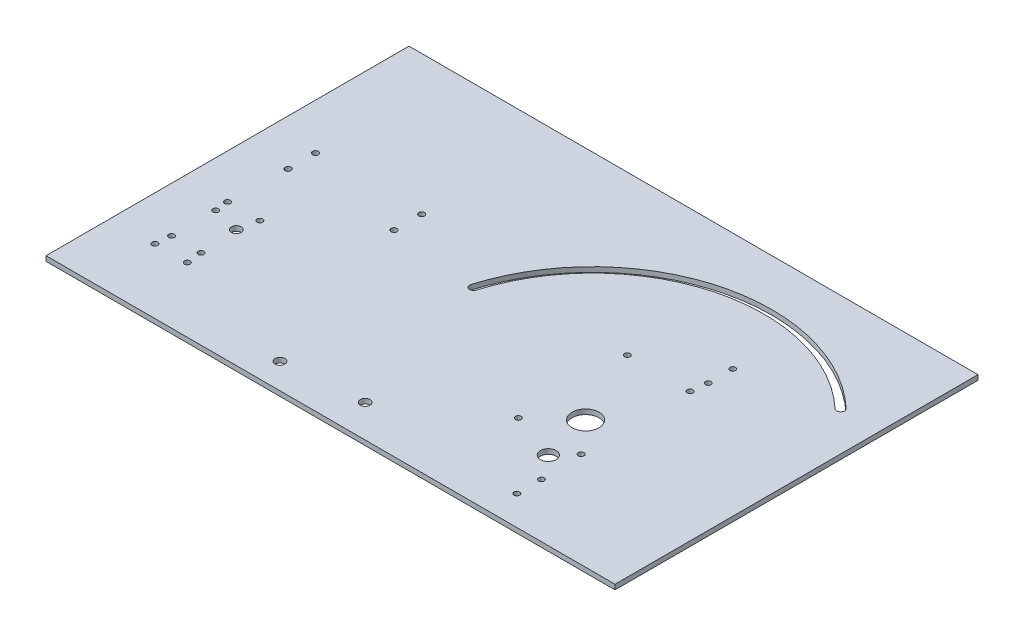
ISO-10303-21;
HEADER;
FILE_DESCRIPTION(('STEP AP214'),'2;1');
FILE_NAME('part.step','',(''),(''),'','','');
FILE_SCHEMA(('AUTOMOTIVE_DESIGN { 1 0 10303 214 1 1 1 1 }'));
ENDSEC;
DATA;
#1=APPLICATION_CONTEXT('core data for automotive mechanical design processes');
#2=APPLICATION_PROTOCOL_DEFINITION('international standard','automotive_design',2000,#1);
#3=PRODUCT_CONTEXT('',#1,'mechanical');
#4=PRODUCT('Part','Part','',(#3));
#5=PRODUCT_RELATED_PRODUCT_CATEGORY('part','',(#4));
#6=PRODUCT_DEFINITION_FORMATION('','',#4);
#7=PRODUCT_DEFINITION_CONTEXT('part definition',#1,'design');
#8=PRODUCT_DEFINITION('design','',#6,#7);
#9=PRODUCT_DEFINITION_SHAPE('','',#8);
#10=(LENGTH_UNIT() NAMED_UNIT(*) SI_UNIT(.MILLI.,.METRE.));
#11=(NAMED_UNIT(*) PLANE_ANGLE_UNIT() SI_UNIT($,.RADIAN.));
#12=(NAMED_UNIT(*) SI_UNIT($,.STERADIAN.) SOLID_ANGLE_UNIT());
#13=UNCERTAINTY_MEASURE_WITH_UNIT(LENGTH_MEASURE(1.E-05),#10,'distance_accuracy_value','');
#14=(GEOMETRIC_REPRESENTATION_CONTEXT(3) GLOBAL_UNCERTAINTY_ASSIGNED_CONTEXT((#13)) GLOBAL_UNIT_ASSIGNED_CONTEXT((#10,
#11,#12)) REPRESENTATION_CONTEXT('',''));
#15=CARTESIAN_POINT('',(0.,0.,0.));
#16=DIRECTION('',(0.,0.,1.));
#17=DIRECTION('',(1.,0.,0.));
#18=AXIS2_PLACEMENT_3D('',#15,#16,#17);
#19=CARTESIAN_POINT('',(0.,3.175,0.));
#20=DIRECTION('',(0.,1.,0.));
#21=DIRECTION('',(0.,0.,1.));
#22=AXIS2_PLACEMENT_3D('',#19,#20,#21);
#23=PLANE('',#22);
#24=CARTESIAN_POINT('',(106.410453434672,3.175,0.373429287609625));
#25=DIRECTION('',(0.,-1.,0.));
#26=DIRECTION('',(0.,0.,1.));
#27=AXIS2_PLACEMENT_3D('',#24,#25,#26);
#28=CIRCLE('',#27,116.205);
#29=CARTESIAN_POINT('',(-5.05726801654176,3.175,-32.4678419952538));
#30=VERTEX_POINT('',#29);
#31=CARTESIAN_POINT('',(185.887196571292,3.175,-84.4030375259801));
#32=VERTEX_POINT('',#31);
#33=EDGE_CURVE('E110',#30,#32,#28,.T.);
#34=ORIENTED_EDGE('',*,*,#33,.T.);
#35=CARTESIAN_POINT('',(184.15,3.175,-82.55));
#36=DIRECTION('',(0.,-1.,0.));
#37=DIRECTION('',(0.,0.,-1.));
#38=AXIS2_PLACEMENT_3D('',#35,#36,#37);
#39=CIRCLE('',#38,2.54);
#40=CARTESIAN_POINT('',(182.412803428708,3.175,-80.6969624740199));
#41=VERTEX_POINT('',#40);
#42=EDGE_CURVE('E120',#32,#41,#39,.T.);
#43=ORIENTED_EDGE('',*,*,#42,.T.);
#44=CARTESIAN_POINT('',(106.410453434672,3.175,0.373429287609625));
#45=DIRECTION('',(0.,1.,0.));
#46=DIRECTION('',(0.,0.,1.));
#47=AXIS2_PLACEMENT_3D('',#44,#45,#46);
#48=CIRCLE('',#47,111.125);
#49=CARTESIAN_POINT('',(-0.184362160750962,3.175,-31.0321580047462));
#50=VERTEX_POINT('',#49);
#51=EDGE_CURVE('E58',#41,#50,#48,.T.);
#52=ORIENTED_EDGE('',*,*,#51,.T.);
#53=CARTESIAN_POINT('',(-2.62081508864638,3.175,-31.75));
#54=DIRECTION('',(0.,-1.,0.));
#55=DIRECTION('',(0.,0.,-1.));
#56=AXIS2_PLACEMENT_3D('',#53,#54,#55);
#57=CIRCLE('',#56,2.54000000000001);
#58=EDGE_CURVE('E117',#50,#30,#57,.T.);
#59=ORIENTED_EDGE('',*,*,#58,.T.);
#60=EDGE_LOOP('',(#34,#43,#52,#59));
#61=FACE_BOUND('',#60,.T.);
#62=DIRECTION('',(1.,0.,0.));
#63=VECTOR('',#62,1.);
#64=CARTESIAN_POINT('',(-158.75,3.175,-146.05));
#65=LINE('',#64,#63);
#66=CARTESIAN_POINT('',(-158.75,3.175,-146.05));
#67=VERTEX_POINT('',#66);
#68=CARTESIAN_POINT('',(209.55,3.175,-146.05));
#69=VERTEX_POINT('',#68);
#70=EDGE_CURVE('E156',#67,#69,#65,.T.);
#71=ORIENTED_EDGE('',*,*,#70,.F.);
#72=DIRECTION('',(0.,0.,1.));
#73=VECTOR('',#72,1.);
#74=CARTESIAN_POINT('',(-158.75,3.175,-88.9));
#75=LINE('',#74,#73);
#76=CARTESIAN_POINT('',(-158.75,3.175,88.9));
#77=VERTEX_POINT('',#76);
#78=EDGE_CURVE('E375',#67,#77,#75,.T.);
#79=ORIENTED_EDGE('',*,*,#78,.T.);
#80=DIRECTION('',(1.,0.,0.));
#81=VECTOR('',#80,1.);
#82=CARTESIAN_POINT('',(-158.75,3.175,88.9));
#83=LINE('',#82,#81);
#84=CARTESIAN_POINT('',(209.55,3.175,88.9));
#85=VERTEX_POINT('',#84);
#86=EDGE_CURVE('E51',#77,#85,#83,.T.);
#87=ORIENTED_EDGE('',*,*,#86,.T.);
#88=DIRECTION('',(0.,0.,1.));
#89=VECTOR('',#88,1.);
#90=CARTESIAN_POINT('',(209.55,3.175,-146.05));
#91=LINE('',#90,#89);
#92=EDGE_CURVE('E160',#69,#85,#91,.T.);
#93=ORIENTED_EDGE('',*,*,#92,.F.);
#94=EDGE_LOOP('',(#71,#79,#87,#93));
#95=FACE_BOUND('',#94,.T.);
#96=CARTESIAN_POINT('',(-129.2225,3.175,37.1475));
#97=DIRECTION('',(0.,1.,0.));
#98=DIRECTION('',(0.,0.,1.));
#99=AXIS2_PLACEMENT_3D('',#96,#97,#98);
#100=CIRCLE('',#99,1.84149999999993);
#101=CARTESIAN_POINT('',(-129.2225,3.175,38.989));
#102=VERTEX_POINT('',#101);
#103=EDGE_CURVE('E215',#102,#102,#100,.T.);
#104=ORIENTED_EDGE('',*,*,#103,.F.);
#105=EDGE_LOOP('',(#104));
#106=FACE_BOUND('',#105,.T.);
#107=CARTESIAN_POINT('',(-130.175,3.175,46.99));
#108=DIRECTION('',(0.,1.,0.));
#109=DIRECTION('',(0.,0.,1.));
#110=AXIS2_PLACEMENT_3D('',#107,#108,#109);
#111=CIRCLE('',#110,1.84149999999999);
#112=CARTESIAN_POINT('',(-130.175,3.175,48.8315));
#113=VERTEX_POINT('',#112);
#114=EDGE_CURVE('E224',#113,#113,#111,.T.);
#115=ORIENTED_EDGE('',*,*,#114,.F.);
#116=EDGE_LOOP('',(#115));
#117=FACE_BOUND('',#116,.T.);
#118=CARTESIAN_POINT('',(-110.1725,3.175,37.1475));
#119=DIRECTION('',(0.,1.,0.));
#120=DIRECTION('',(0.,0.,1.));
#121=AXIS2_PLACEMENT_3D('',#118,#119,#120);
#122=CIRCLE('',#121,1.84149999999996);
#123=CARTESIAN_POINT('',(-110.1725,3.175,38.989));
#124=VERTEX_POINT('',#123);
#125=EDGE_CURVE('E199',#124,#124,#122,.T.);
#126=ORIENTED_EDGE('',*,*,#125,.F.);
#127=EDGE_LOOP('',(#126));
#128=FACE_BOUND('',#127,.T.);
#129=CARTESIAN_POINT('',(-129.2225,3.175,8.57250000000002));
#130=DIRECTION('',(0.,1.,0.));
#131=DIRECTION('',(0.,0.,1.));
#132=AXIS2_PLACEMENT_3D('',#129,#130,#131);
#133=CIRCLE('',#132,1.84150000000002);
#134=CARTESIAN_POINT('',(-129.2225,3.175,10.414));
#135=VERTEX_POINT('',#134);
#136=EDGE_CURVE('E208',#135,#135,#133,.T.);
#137=ORIENTED_EDGE('',*,*,#136,.F.);
#138=EDGE_LOOP('',(#137));
#139=FACE_BOUND('',#138,.T.);
#140=CARTESIAN_POINT('',(85.0900000000001,3.175,-43.4975));
#141=DIRECTION('',(0.,1.,0.));
#142=DIRECTION('',(0.,0.,1.));
#143=AXIS2_PLACEMENT_3D('',#140,#141,#142);
#144=CIRCLE('',#143,1.84150000000004);
#145=CARTESIAN_POINT('',(85.0900000000001,3.175,-41.6559999999999));
#146=VERTEX_POINT('',#145);
#147=EDGE_CURVE('E247',#146,#146,#144,.T.);
#148=ORIENTED_EDGE('',*,*,#147,.F.);
#149=EDGE_LOOP('',(#148));
#150=FACE_BOUND('',#149,.T.);
#151=CARTESIAN_POINT('',(85.0900000000001,3.175,26.9875));
#152=DIRECTION('',(0.,1.,0.));
#153=DIRECTION('',(0.,0.,1.));
#154=AXIS2_PLACEMENT_3D('',#151,#152,#153);
#155=CIRCLE('',#154,1.84149999999996);
#156=CARTESIAN_POINT('',(85.0900000000001,3.175,28.829));
#157=VERTEX_POINT('',#156);
#158=EDGE_CURVE('E256',#157,#157,#155,.T.);
#159=ORIENTED_EDGE('',*,*,#158,.F.);
#160=EDGE_LOOP('',(#159));
#161=FACE_BOUND('',#160,.T.);
#162=CARTESIAN_POINT('',(125.73,3.175,26.9875));
#163=DIRECTION('',(0.,1.,0.));
#164=DIRECTION('',(0.,0.,1.));
#165=AXIS2_PLACEMENT_3D('',#162,#163,#164);
#166=CIRCLE('',#165,1.84149999999999);
#167=CARTESIAN_POINT('',(125.73,3.175,28.829));
#168=VERTEX_POINT('',#167);
#169=EDGE_CURVE('E231',#168,#168,#166,.T.);
#170=ORIENTED_EDGE('',*,*,#169,.F.);
#171=EDGE_LOOP('',(#170));
#172=FACE_BOUND('',#171,.T.);
#173=CARTESIAN_POINT('',(-109.22,3.175,46.99));
#174=DIRECTION('',(0.,1.,0.));
#175=DIRECTION('',(0.,0.,1.));
#176=AXIS2_PLACEMENT_3D('',#173,#174,#175);
#177=CIRCLE('',#176,1.8415);
#178=CARTESIAN_POINT('',(-109.22,3.175,48.8315));
#179=VERTEX_POINT('',#178);
#180=EDGE_CURVE('E240',#179,#179,#177,.T.);
#181=ORIENTED_EDGE('',*,*,#180,.F.);
#182=EDGE_LOOP('',(#181));
#183=FACE_BOUND('',#182,.T.);
#184=CARTESIAN_POINT('',(-130.175,3.175,0.));
#185=DIRECTION('',(0.,1.,0.));
#186=DIRECTION('',(0.,0.,1.));
#187=AXIS2_PLACEMENT_3D('',#184,#185,#186);
#188=CIRCLE('',#187,1.84149999999999);
#189=CARTESIAN_POINT('',(-130.175,3.175,1.8415));
#190=VERTEX_POINT('',#189);
#191=EDGE_CURVE('E183',#190,#190,#188,.T.);
#192=ORIENTED_EDGE('',*,*,#191,.F.);
#193=EDGE_LOOP('',(#192));
#194=FACE_BOUND('',#193,.T.);
#195=CARTESIAN_POINT('',(-109.22,3.175,0.));
#196=DIRECTION('',(0.,1.,0.));
#197=DIRECTION('',(0.,0.,1.));
#198=AXIS2_PLACEMENT_3D('',#195,#196,#197);
#199=CIRCLE('',#198,1.8415);
#200=CARTESIAN_POINT('',(-109.22,3.175,1.84150000000001));
#201=VERTEX_POINT('',#200);
#202=EDGE_CURVE('E192',#201,#201,#199,.T.);
#203=ORIENTED_EDGE('',*,*,#202,.F.);
#204=EDGE_LOOP('',(#203));
#205=FACE_BOUND('',#204,.T.);
#206=CARTESIAN_POINT('',(125.73,3.175,-43.4975));
#207=DIRECTION('',(0.,1.,0.));
#208=DIRECTION('',(0.,0.,1.));
#209=AXIS2_PLACEMENT_3D('',#206,#207,#208);
#210=CIRCLE('',#209,1.84150000000002);
#211=CARTESIAN_POINT('',(125.73,3.175,-41.6559999999999));
#212=VERTEX_POINT('',#211);
#213=EDGE_CURVE('E251',#212,#212,#210,.T.);
#214=ORIENTED_EDGE('',*,*,#213,.F.);
#215=EDGE_LOOP('',(#214));
#216=FACE_BOUND('',#215,.T.);
#217=CARTESIAN_POINT('',(127.,3.175,69.85));
#218=DIRECTION('',(0.,-1.,0.));
#219=DIRECTION('',(0.,0.,-1.));
#220=AXIS2_PLACEMENT_3D('',#217,#218,#219);
#221=CIRCLE('',#220,1.80340000000001);
#222=CARTESIAN_POINT('',(127.,3.175,68.0466));
#223=VERTEX_POINT('',#222);
#224=EDGE_CURVE('E271',#223,#223,#221,.T.);
#225=ORIENTED_EDGE('',*,*,#224,.T.);
#226=EDGE_LOOP('',(#225));
#227=FACE_BOUND('',#226,.T.);
#228=CARTESIAN_POINT('',(127.,3.175,53.975));
#229=DIRECTION('',(0.,-1.,0.));
#230=DIRECTION('',(0.,0.,-1.));
#231=AXIS2_PLACEMENT_3D('',#228,#229,#230);
#232=CIRCLE('',#231,1.80340000000001);
#233=CARTESIAN_POINT('',(127.,3.175,52.1716));
#234=VERTEX_POINT('',#233);
#235=EDGE_CURVE('E284',#234,#234,#232,.T.);
#236=ORIENTED_EDGE('',*,*,#235,.T.);
#237=EDGE_LOOP('',(#236));
#238=FACE_BOUND('',#237,.T.);
#239=CARTESIAN_POINT('',(127.,3.175,-53.975));
#240=DIRECTION('',(0.,-1.,0.));
#241=DIRECTION('',(0.,0.,-1.));
#242=AXIS2_PLACEMENT_3D('',#239,#240,#241);
#243=CIRCLE('',#242,1.80340000000001);
#244=CARTESIAN_POINT('',(127.,3.175,-55.7784));
#245=VERTEX_POINT('',#244);
#246=EDGE_CURVE('E292',#245,#245,#243,.T.);
#247=ORIENTED_EDGE('',*,*,#246,.T.);
#248=EDGE_LOOP('',(#247));
#249=FACE_BOUND('',#248,.T.);
#250=CARTESIAN_POINT('',(127.,3.175,-69.85));
#251=DIRECTION('',(0.,-1.,0.));
#252=DIRECTION('',(0.,0.,-1.));
#253=AXIS2_PLACEMENT_3D('',#250,#251,#252);
#254=CIRCLE('',#253,1.80340000000001);
#255=CARTESIAN_POINT('',(127.,3.175,-71.6534));
#256=VERTEX_POINT('',#255);
#257=EDGE_CURVE('E267',#256,#256,#254,.T.);
#258=ORIENTED_EDGE('',*,*,#257,.T.);
#259=EDGE_LOOP('',(#258));
#260=FACE_BOUND('',#259,.T.);
#261=CARTESIAN_POINT('',(115.57,3.175,38.1));
#262=DIRECTION('',(0.,1.,0.));
#263=DIRECTION('',(0.,0.,1.));
#264=AXIS2_PLACEMENT_3D('',#261,#262,#263);
#265=CIRCLE('',#264,5.08000000000001);
#266=CARTESIAN_POINT('',(115.57,3.175,43.18));
#267=VERTEX_POINT('',#266);
#268=EDGE_CURVE('E275',#267,#267,#265,.T.);
#269=ORIENTED_EDGE('',*,*,#268,.F.);
#270=EDGE_LOOP('',(#269));
#271=FACE_BOUND('',#270,.T.);
#272=CARTESIAN_POINT('',(-23.829539608584,3.175,72.39));
#273=DIRECTION('',(0.,-1.,0.));
#274=DIRECTION('',(0.,0.,-1.));
#275=AXIS2_PLACEMENT_3D('',#272,#273,#274);
#276=CIRCLE('',#275,3.175);
#277=CARTESIAN_POINT('',(-23.829539608584,3.175,69.215));
#278=VERTEX_POINT('',#277);
#279=EDGE_CURVE('E311',#278,#278,#276,.T.);
#280=ORIENTED_EDGE('',*,*,#279,.T.);
#281=EDGE_LOOP('',(#280));
#282=FACE_BOUND('',#281,.T.);
#283=CARTESIAN_POINT('',(26.764302072,3.175,67.818));
#284=DIRECTION('',(0.,-1.,0.));
#285=DIRECTION('',(0.,0.,-1.));
#286=AXIS2_PLACEMENT_3D('',#283,#284,#285);
#287=CIRCLE('',#286,3.175);
#288=CARTESIAN_POINT('',(26.764302072,3.175,64.643));
#289=VERTEX_POINT('',#288);
#290=EDGE_CURVE('E320',#289,#289,#287,.T.);
#291=ORIENTED_EDGE('',*,*,#290,.T.);
#292=EDGE_LOOP('',(#291));
#293=FACE_BOUND('',#292,.T.);
#294=CARTESIAN_POINT('',(-129.032,3.175,-38.1));
#295=DIRECTION('',(0.,1.,0.));
#296=DIRECTION('',(0.,0.,1.));
#297=AXIS2_PLACEMENT_3D('',#294,#295,#296);
#298=CIRCLE('',#297,1.90499999999999);
#299=CARTESIAN_POINT('',(-129.032,3.175,-36.195));
#300=VERTEX_POINT('',#299);
#301=EDGE_CURVE('E335',#300,#300,#298,.T.);
#302=ORIENTED_EDGE('',*,*,#301,.F.);
#303=EDGE_LOOP('',(#302));
#304=FACE_BOUND('',#303,.T.);
#305=CARTESIAN_POINT('',(-129.032,3.175,-55.88));
#306=DIRECTION('',(0.,1.,0.));
#307=DIRECTION('',(0.,0.,1.));
#308=AXIS2_PLACEMENT_3D('',#305,#306,#307);
#309=CIRCLE('',#308,1.90499999999999);
#310=CARTESIAN_POINT('',(-129.032,3.175,-53.975));
#311=VERTEX_POINT('',#310);
#312=EDGE_CURVE('E351',#311,#311,#309,.T.);
#313=ORIENTED_EDGE('',*,*,#312,.F.);
#314=EDGE_LOOP('',(#313));
#315=FACE_BOUND('',#314,.T.);
#316=CARTESIAN_POINT('',(-111.76,3.175,12.7));
#317=DIRECTION('',(0.,1.,0.));
#318=DIRECTION('',(0.,0.,1.));
#319=AXIS2_PLACEMENT_3D('',#316,#317,#318);
#320=CIRCLE('',#319,3.175);
#321=CARTESIAN_POINT('',(-111.76,3.175,15.875));
#322=VERTEX_POINT('',#321);
#323=EDGE_CURVE('E367',#322,#322,#320,.T.);
#324=ORIENTED_EDGE('',*,*,#323,.F.);
#325=EDGE_LOOP('',(#324));
#326=FACE_BOUND('',#325,.T.);
#327=CARTESIAN_POINT('',(107.95,3.175,6.35000000000002));
#328=DIRECTION('',(0.,1.,0.));
#329=DIRECTION('',(0.,0.,1.));
#330=AXIS2_PLACEMENT_3D('',#327,#328,#329);
#331=CIRCLE('',#330,8.73125);
#332=CARTESIAN_POINT('',(107.95,3.175,15.08125));
#333=VERTEX_POINT('',#332);
#334=EDGE_CURVE('E359',#333,#333,#331,.T.);
#335=ORIENTED_EDGE('',*,*,#334,.F.);
#336=EDGE_LOOP('',(#335));
#337=FACE_BOUND('',#336,.T.);
#338=CARTESIAN_POINT('',(-60.452,3.175,-55.88));
#339=DIRECTION('',(0.,1.,0.));
#340=DIRECTION('',(0.,0.,1.));
#341=AXIS2_PLACEMENT_3D('',#338,#339,#340);
#342=CIRCLE('',#341,1.90500000000001);
#343=CARTESIAN_POINT('',(-60.452,3.175,-53.975));
#344=VERTEX_POINT('',#343);
#345=EDGE_CURVE('E343',#344,#344,#342,.T.);
#346=ORIENTED_EDGE('',*,*,#345,.F.);
#347=EDGE_LOOP('',(#346));
#348=FACE_BOUND('',#347,.T.);
#349=CARTESIAN_POINT('',(-60.452,3.175,-38.1));
#350=DIRECTION('',(0.,1.,0.));
#351=DIRECTION('',(0.,0.,1.));
#352=AXIS2_PLACEMENT_3D('',#349,#350,#351);
#353=CIRCLE('',#352,1.90500000000001);
#354=CARTESIAN_POINT('',(-60.452,3.175,-36.195));
#355=VERTEX_POINT('',#354);
#356=EDGE_CURVE('E327',#355,#355,#353,.T.);
#357=ORIENTED_EDGE('',*,*,#356,.F.);
#358=EDGE_LOOP('',(#357));
#359=FACE_BOUND('',#358,.T.);
#360=ADVANCED_FACE('F42',(#61,#95,#106,#117,#128,#139,#150,#161,#172,#183,#194,#205,#216,#227,
#238,#249,#260,#271,#282,#293,#304,#315,#326,#337,#348,#359),#23,.T.);
#361=CARTESIAN_POINT('',(0.,0.,0.));
#362=DIRECTION('',(0.,1.,0.));
#363=DIRECTION('',(0.,0.,1.));
#364=AXIS2_PLACEMENT_3D('',#361,#362,#363);
#365=PLANE('',#364);
#366=CARTESIAN_POINT('',(184.15,0.,-82.55));
#367=DIRECTION('',(0.,-1.,0.));
#368=DIRECTION('',(0.,0.,-1.));
#369=AXIS2_PLACEMENT_3D('',#366,#367,#368);
#370=CIRCLE('',#369,2.54);
#371=CARTESIAN_POINT('',(185.887196571292,0.,-84.4030375259801));
#372=VERTEX_POINT('',#371);
#373=CARTESIAN_POINT('',(182.412803428708,0.,-80.6969624740199));
#374=VERTEX_POINT('',#373);
#375=EDGE_CURVE('E141',#372,#374,#370,.T.);
#376=ORIENTED_EDGE('',*,*,#375,.F.);
#377=CARTESIAN_POINT('',(106.410453434672,0.,0.373429287609625));
#378=DIRECTION('',(0.,-1.,0.));
#379=DIRECTION('',(0.,0.,1.));
#380=AXIS2_PLACEMENT_3D('',#377,#378,#379);
#381=CIRCLE('',#380,116.205);
#382=CARTESIAN_POINT('',(-5.05726801654176,0.,-32.4678419952538));
#383=VERTEX_POINT('',#382);
#384=EDGE_CURVE('E66',#383,#372,#381,.T.);
#385=ORIENTED_EDGE('',*,*,#384,.F.);
#386=CARTESIAN_POINT('',(-2.62081508864638,0.,-31.75));
#387=DIRECTION('',(0.,-1.,0.));
#388=DIRECTION('',(0.,0.,-1.));
#389=AXIS2_PLACEMENT_3D('',#386,#387,#388);
#390=CIRCLE('',#389,2.54000000000001);
#391=CARTESIAN_POINT('',(-0.184362160750962,0.,-31.0321580047462));
#392=VERTEX_POINT('',#391);
#393=EDGE_CURVE('E128',#392,#383,#390,.T.);
#394=ORIENTED_EDGE('',*,*,#393,.F.);
#395=CARTESIAN_POINT('',(106.410453434672,0.,0.373429287609625));
#396=DIRECTION('',(0.,1.,0.));
#397=DIRECTION('',(0.,0.,1.));
#398=AXIS2_PLACEMENT_3D('',#395,#396,#397);
#399=CIRCLE('',#398,111.125);
#400=EDGE_CURVE('E132',#374,#392,#399,.T.);
#401=ORIENTED_EDGE('',*,*,#400,.F.);
#402=EDGE_LOOP('',(#376,#385,#394,#401));
#403=FACE_BOUND('',#402,.T.);
#404=DIRECTION('',(0.,0.,1.));
#405=VECTOR('',#404,1.);
#406=CARTESIAN_POINT('',(-158.75,0.,-88.9));
#407=LINE('',#406,#405);
#408=CARTESIAN_POINT('',(-158.75,0.,-146.05));
#409=VERTEX_POINT('',#408);
#410=CARTESIAN_POINT('',(-158.75,0.,88.9));
#411=VERTEX_POINT('',#410);
#412=EDGE_CURVE('E371',#409,#411,#407,.T.);
#413=ORIENTED_EDGE('',*,*,#412,.F.);
#414=DIRECTION('',(1.,0.,0.));
#415=VECTOR('',#414,1.);
#416=CARTESIAN_POINT('',(-158.75,0.,-146.05));
#417=LINE('',#416,#415);
#418=CARTESIAN_POINT('',(209.55,0.,-146.05));
#419=VERTEX_POINT('',#418);
#420=EDGE_CURVE('E150',#409,#419,#417,.T.);
#421=ORIENTED_EDGE('',*,*,#420,.T.);
#422=DIRECTION('',(0.,0.,1.));
#423=VECTOR('',#422,1.);
#424=CARTESIAN_POINT('',(209.55,0.,-146.05));
#425=LINE('',#424,#423);
#426=CARTESIAN_POINT('',(209.55,0.,88.9));
#427=VERTEX_POINT('',#426);
#428=EDGE_CURVE('E161',#419,#427,#425,.T.);
#429=ORIENTED_EDGE('',*,*,#428,.T.);
#430=DIRECTION('',(1.,0.,0.));
#431=VECTOR('',#430,1.);
#432=CARTESIAN_POINT('',(-158.75,0.,88.9));
#433=LINE('',#432,#431);
#434=EDGE_CURVE('E378',#411,#427,#433,.T.);
#435=ORIENTED_EDGE('',*,*,#434,.F.);
#436=EDGE_LOOP('',(#413,#421,#429,#435));
#437=FACE_BOUND('',#436,.T.);
#438=CARTESIAN_POINT('',(-129.2225,0.,37.1475));
#439=DIRECTION('',(0.,1.,0.));
#440=DIRECTION('',(0.,0.,1.));
#441=AXIS2_PLACEMENT_3D('',#438,#439,#440);
#442=CIRCLE('',#441,1.84149999999993);
#443=CARTESIAN_POINT('',(-129.2225,0.,38.989));
#444=VERTEX_POINT('',#443);
#445=EDGE_CURVE('E220',#444,#444,#442,.T.);
#446=ORIENTED_EDGE('',*,*,#445,.T.);
#447=EDGE_LOOP('',(#446));
#448=FACE_BOUND('',#447,.T.);
#449=CARTESIAN_POINT('',(-130.175,0.,46.99));
#450=DIRECTION('',(0.,1.,0.));
#451=DIRECTION('',(0.,0.,1.));
#452=AXIS2_PLACEMENT_3D('',#449,#450,#451);
#453=CIRCLE('',#452,1.84149999999999);
#454=CARTESIAN_POINT('',(-130.175,0.,48.8315));
#455=VERTEX_POINT('',#454);
#456=EDGE_CURVE('E203',#455,#455,#453,.T.);
#457=ORIENTED_EDGE('',*,*,#456,.T.);
#458=EDGE_LOOP('',(#457));
#459=FACE_BOUND('',#458,.T.);
#460=CARTESIAN_POINT('',(-110.1725,0.,37.1475));
#461=DIRECTION('',(0.,1.,0.));
#462=DIRECTION('',(0.,0.,1.));
#463=AXIS2_PLACEMENT_3D('',#460,#461,#462);
#464=CIRCLE('',#463,1.84149999999996);
#465=CARTESIAN_POINT('',(-110.1725,0.,38.989));
#466=VERTEX_POINT('',#465);
#467=EDGE_CURVE('E204',#466,#466,#464,.T.);
#468=ORIENTED_EDGE('',*,*,#467,.T.);
#469=EDGE_LOOP('',(#468));
#470=FACE_BOUND('',#469,.T.);
#471=CARTESIAN_POINT('',(-129.2225,0.,8.57250000000002));
#472=DIRECTION('',(0.,1.,0.));
#473=DIRECTION('',(0.,0.,1.));
#474=AXIS2_PLACEMENT_3D('',#471,#472,#473);
#475=CIRCLE('',#474,1.84150000000002);
#476=CARTESIAN_POINT('',(-129.2225,0.,10.414));
#477=VERTEX_POINT('',#476);
#478=EDGE_CURVE('E187',#477,#477,#475,.T.);
#479=ORIENTED_EDGE('',*,*,#478,.T.);
#480=EDGE_LOOP('',(#479));
#481=FACE_BOUND('',#480,.T.);
#482=CARTESIAN_POINT('',(85.0900000000001,0.,-43.4975));
#483=DIRECTION('',(0.,1.,0.));
#484=DIRECTION('',(0.,0.,1.));
#485=AXIS2_PLACEMENT_3D('',#482,#483,#484);
#486=CIRCLE('',#485,1.84150000000004);
#487=CARTESIAN_POINT('',(85.0900000000001,0.,-41.6559999999999));
#488=VERTEX_POINT('',#487);
#489=EDGE_CURVE('E252',#488,#488,#486,.T.);
#490=ORIENTED_EDGE('',*,*,#489,.T.);
#491=EDGE_LOOP('',(#490));
#492=FACE_BOUND('',#491,.T.);
#493=CARTESIAN_POINT('',(85.0900000000001,0.,26.9875));
#494=DIRECTION('',(0.,1.,0.));
#495=DIRECTION('',(0.,0.,1.));
#496=AXIS2_PLACEMENT_3D('',#493,#494,#495);
#497=CIRCLE('',#496,1.84149999999996);
#498=CARTESIAN_POINT('',(85.0900000000001,0.,28.829));
#499=VERTEX_POINT('',#498);
#500=EDGE_CURVE('E235',#499,#499,#497,.T.);
#501=ORIENTED_EDGE('',*,*,#500,.T.);
#502=EDGE_LOOP('',(#501));
#503=FACE_BOUND('',#502,.T.);
#504=CARTESIAN_POINT('',(125.73,0.,26.9875));
#505=DIRECTION('',(0.,1.,0.));
#506=DIRECTION('',(0.,0.,1.));
#507=AXIS2_PLACEMENT_3D('',#504,#505,#506);
#508=CIRCLE('',#507,1.84149999999999);
#509=CARTESIAN_POINT('',(125.73,0.,28.829));
#510=VERTEX_POINT('',#509);
#511=EDGE_CURVE('E236',#510,#510,#508,.T.);
#512=ORIENTED_EDGE('',*,*,#511,.T.);
#513=EDGE_LOOP('',(#512));
#514=FACE_BOUND('',#513,.T.);
#515=CARTESIAN_POINT('',(-109.22,0.,46.99));
#516=DIRECTION('',(0.,1.,0.));
#517=DIRECTION('',(0.,0.,1.));
#518=AXIS2_PLACEMENT_3D('',#515,#516,#517);
#519=CIRCLE('',#518,1.8415);
#520=CARTESIAN_POINT('',(-109.22,0.,48.8315));
#521=VERTEX_POINT('',#520);
#522=EDGE_CURVE('E219',#521,#521,#519,.T.);
#523=ORIENTED_EDGE('',*,*,#522,.T.);
#524=EDGE_LOOP('',(#523));
#525=FACE_BOUND('',#524,.T.);
#526=CARTESIAN_POINT('',(-130.175,0.,0.));
#527=DIRECTION('',(0.,1.,0.));
#528=DIRECTION('',(0.,0.,1.));
#529=AXIS2_PLACEMENT_3D('',#526,#527,#528);
#530=CIRCLE('',#529,1.84149999999999);
#531=CARTESIAN_POINT('',(-130.175,0.,1.8415));
#532=VERTEX_POINT('',#531);
#533=EDGE_CURVE('E188',#532,#532,#530,.T.);
#534=ORIENTED_EDGE('',*,*,#533,.T.);
#535=EDGE_LOOP('',(#534));
#536=FACE_BOUND('',#535,.T.);
#537=CARTESIAN_POINT('',(-109.22,0.,0.));
#538=DIRECTION('',(0.,1.,0.));
#539=DIRECTION('',(0.,0.,1.));
#540=AXIS2_PLACEMENT_3D('',#537,#538,#539);
#541=CIRCLE('',#540,1.8415);
#542=CARTESIAN_POINT('',(-109.22,0.,1.84150000000001));
#543=VERTEX_POINT('',#542);
#544=EDGE_CURVE('E176',#543,#543,#541,.T.);
#545=ORIENTED_EDGE('',*,*,#544,.T.);
#546=EDGE_LOOP('',(#545));
#547=FACE_BOUND('',#546,.T.);
#548=CARTESIAN_POINT('',(125.73,0.,-43.4975));
#549=DIRECTION('',(0.,1.,0.));
#550=DIRECTION('',(0.,0.,1.));
#551=AXIS2_PLACEMENT_3D('',#548,#549,#550);
#552=CIRCLE('',#551,1.84150000000002);
#553=CARTESIAN_POINT('',(125.73,0.,-41.6559999999999));
#554=VERTEX_POINT('',#553);
#555=EDGE_CURVE('E263',#554,#554,#552,.T.);
#556=ORIENTED_EDGE('',*,*,#555,.T.);
#557=EDGE_LOOP('',(#556));
#558=FACE_BOUND('',#557,.T.);
#559=CARTESIAN_POINT('',(127.,0.,69.85));
#560=DIRECTION('',(0.,-1.,0.));
#561=DIRECTION('',(0.,0.,-1.));
#562=AXIS2_PLACEMENT_3D('',#559,#560,#561);
#563=CIRCLE('',#562,1.80340000000001);
#564=CARTESIAN_POINT('',(127.,0.,68.0466));
#565=VERTEX_POINT('',#564);
#566=EDGE_CURVE('E276',#565,#565,#563,.T.);
#567=ORIENTED_EDGE('',*,*,#566,.F.);
#568=EDGE_LOOP('',(#567));
#569=FACE_BOUND('',#568,.T.);
#570=CARTESIAN_POINT('',(127.,0.,53.975));
#571=DIRECTION('',(0.,-1.,0.));
#572=DIRECTION('',(0.,0.,-1.));
#573=AXIS2_PLACEMENT_3D('',#570,#571,#572);
#574=CIRCLE('',#573,1.80340000000001);
#575=CARTESIAN_POINT('',(127.,0.,52.1716));
#576=VERTEX_POINT('',#575);
#577=EDGE_CURVE('E280',#576,#576,#574,.T.);
#578=ORIENTED_EDGE('',*,*,#577,.F.);
#579=EDGE_LOOP('',(#578));
#580=FACE_BOUND('',#579,.T.);
#581=CARTESIAN_POINT('',(127.,0.,-53.975));
#582=DIRECTION('',(0.,-1.,0.));
#583=DIRECTION('',(0.,0.,-1.));
#584=AXIS2_PLACEMENT_3D('',#581,#582,#583);
#585=CIRCLE('',#584,1.80340000000001);
#586=CARTESIAN_POINT('',(127.,0.,-55.7784));
#587=VERTEX_POINT('',#586);
#588=EDGE_CURVE('E288',#587,#587,#585,.T.);
#589=ORIENTED_EDGE('',*,*,#588,.F.);
#590=EDGE_LOOP('',(#589));
#591=FACE_BOUND('',#590,.T.);
#592=CARTESIAN_POINT('',(127.,0.,-69.85));
#593=DIRECTION('',(0.,-1.,0.));
#594=DIRECTION('',(0.,0.,-1.));
#595=AXIS2_PLACEMENT_3D('',#592,#593,#594);
#596=CIRCLE('',#595,1.80340000000001);
#597=CARTESIAN_POINT('',(127.,0.,-71.6534));
#598=VERTEX_POINT('',#597);
#599=EDGE_CURVE('E296',#598,#598,#596,.T.);
#600=ORIENTED_EDGE('',*,*,#599,.F.);
#601=EDGE_LOOP('',(#600));
#602=FACE_BOUND('',#601,.T.);
#603=CARTESIAN_POINT('',(115.57,0.,38.1));
#604=DIRECTION('',(0.,1.,0.));
#605=DIRECTION('',(0.,0.,1.));
#606=AXIS2_PLACEMENT_3D('',#603,#604,#605);
#607=CIRCLE('',#606,5.08000000000001);
#608=CARTESIAN_POINT('',(115.57,0.,43.18));
#609=VERTEX_POINT('',#608);
#610=EDGE_CURVE('E303',#609,#609,#607,.T.);
#611=ORIENTED_EDGE('',*,*,#610,.T.);
#612=EDGE_LOOP('',(#611));
#613=FACE_BOUND('',#612,.T.);
#614=CARTESIAN_POINT('',(-23.829539608584,0.,72.39));
#615=DIRECTION('',(0.,-1.,0.));
#616=DIRECTION('',(0.,0.,-1.));
#617=AXIS2_PLACEMENT_3D('',#614,#615,#616);
#618=CIRCLE('',#617,3.175);
#619=CARTESIAN_POINT('',(-23.829539608584,0.,69.215));
#620=VERTEX_POINT('',#619);
#621=EDGE_CURVE('E316',#620,#620,#618,.T.);
#622=ORIENTED_EDGE('',*,*,#621,.F.);
#623=EDGE_LOOP('',(#622));
#624=FACE_BOUND('',#623,.T.);
#625=CARTESIAN_POINT('',(26.764302072,0.,67.818));
#626=DIRECTION('',(0.,-1.,0.));
#627=DIRECTION('',(0.,0.,-1.));
#628=AXIS2_PLACEMENT_3D('',#625,#626,#627);
#629=CIRCLE('',#628,3.175);
#630=CARTESIAN_POINT('',(26.764302072,0.,64.643));
#631=VERTEX_POINT('',#630);
#632=EDGE_CURVE('E307',#631,#631,#629,.T.);
#633=ORIENTED_EDGE('',*,*,#632,.F.);
#634=EDGE_LOOP('',(#633));
#635=FACE_BOUND('',#634,.T.);
#636=CARTESIAN_POINT('',(-111.76,0.,12.7));
#637=DIRECTION('',(0.,1.,0.));
#638=DIRECTION('',(0.,0.,1.));
#639=AXIS2_PLACEMENT_3D('',#636,#637,#638);
#640=CIRCLE('',#639,3.175);
#641=CARTESIAN_POINT('',(-111.76,0.,15.875));
#642=VERTEX_POINT('',#641);
#643=EDGE_CURVE('E363',#642,#642,#640,.T.);
#644=ORIENTED_EDGE('',*,*,#643,.T.);
#645=EDGE_LOOP('',(#644));
#646=FACE_BOUND('',#645,.T.);
#647=CARTESIAN_POINT('',(107.95,0.,6.35000000000002));
#648=DIRECTION('',(0.,1.,0.));
#649=DIRECTION('',(0.,0.,1.));
#650=AXIS2_PLACEMENT_3D('',#647,#648,#649);
#651=CIRCLE('',#650,8.73125);
#652=CARTESIAN_POINT('',(107.95,0.,15.08125));
#653=VERTEX_POINT('',#652);
#654=EDGE_CURVE('E355',#653,#653,#651,.T.);
#655=ORIENTED_EDGE('',*,*,#654,.T.);
#656=EDGE_LOOP('',(#655));
#657=FACE_BOUND('',#656,.T.);
#658=CARTESIAN_POINT('',(-129.032,0.,-55.88));
#659=DIRECTION('',(0.,1.,0.));
#660=DIRECTION('',(0.,0.,1.));
#661=AXIS2_PLACEMENT_3D('',#658,#659,#660);
#662=CIRCLE('',#661,1.90499999999999);
#663=CARTESIAN_POINT('',(-129.032,0.,-53.975));
#664=VERTEX_POINT('',#663);
#665=EDGE_CURVE('E347',#664,#664,#662,.T.);
#666=ORIENTED_EDGE('',*,*,#665,.T.);
#667=EDGE_LOOP('',(#666));
#668=FACE_BOUND('',#667,.T.);
#669=CARTESIAN_POINT('',(-60.452,0.,-55.88));
#670=DIRECTION('',(0.,1.,0.));
#671=DIRECTION('',(0.,0.,1.));
#672=AXIS2_PLACEMENT_3D('',#669,#670,#671);
#673=CIRCLE('',#672,1.90500000000001);
#674=CARTESIAN_POINT('',(-60.452,0.,-53.975));
#675=VERTEX_POINT('',#674);
#676=EDGE_CURVE('E339',#675,#675,#673,.T.);
#677=ORIENTED_EDGE('',*,*,#676,.T.);
#678=EDGE_LOOP('',(#677));
#679=FACE_BOUND('',#678,.T.);
#680=CARTESIAN_POINT('',(-129.032,0.,-38.1));
#681=DIRECTION('',(0.,1.,0.));
#682=DIRECTION('',(0.,0.,1.));
#683=AXIS2_PLACEMENT_3D('',#680,#681,#682);
#684=CIRCLE('',#683,1.90499999999999);
#685=CARTESIAN_POINT('',(-129.032,0.,-36.195));
#686=VERTEX_POINT('',#685);
#687=EDGE_CURVE('E331',#686,#686,#684,.T.);
#688=ORIENTED_EDGE('',*,*,#687,.T.);
#689=EDGE_LOOP('',(#688));
#690=FACE_BOUND('',#689,.T.);
#691=CARTESIAN_POINT('',(-60.452,0.,-38.1));
#692=DIRECTION('',(0.,1.,0.));
#693=DIRECTION('',(0.,0.,1.));
#694=AXIS2_PLACEMENT_3D('',#691,#692,#693);
#695=CIRCLE('',#694,1.90500000000001);
#696=CARTESIAN_POINT('',(-60.452,0.,-36.195));
#697=VERTEX_POINT('',#696);
#698=EDGE_CURVE('E315',#697,#697,#695,.T.);
#699=ORIENTED_EDGE('',*,*,#698,.T.);
#700=EDGE_LOOP('',(#699));
#701=FACE_BOUND('',#700,.T.);
#702=ADVANCED_FACE('F394',(#403,#437,#448,#459,#470,#481,#492,#503,#514,#525,#536,#547,#558,
#569,#580,#591,#602,#613,#624,#635,#646,#657,#668,#679,#690,#701),#365,.F.);
#703=CARTESIAN_POINT('',(-158.75,3.175,-88.9));
#704=DIRECTION('',(1.,0.,0.));
#705=DIRECTION('',(0.,0.,-1.));
#706=AXIS2_PLACEMENT_3D('',#703,#704,#705);
#707=PLANE('',#706);
#708=ORIENTED_EDGE('',*,*,#412,.T.);
#709=DIRECTION('',(0.,-1.,0.));
#710=VECTOR('',#709,1.);
#711=CARTESIAN_POINT('',(-158.75,3.175,88.9));
#712=LINE('',#711,#710);
#713=EDGE_CURVE('E11',#77,#411,#712,.T.);
#714=ORIENTED_EDGE('',*,*,#713,.F.);
#715=ORIENTED_EDGE('',*,*,#78,.F.);
#716=DIRECTION('',(0.,-1.,0.));
#717=VECTOR('',#716,1.);
#718=CARTESIAN_POINT('',(-158.75,3.175,-146.05));
#719=LINE('',#718,#717);
#720=EDGE_CURVE('E165',#67,#409,#719,.T.);
#721=ORIENTED_EDGE('',*,*,#720,.T.);
#722=EDGE_LOOP('',(#708,#714,#715,#721));
#723=FACE_BOUND('',#722,.T.);
#724=ADVANCED_FACE('F44',(#723),#707,.F.);
#725=CARTESIAN_POINT('',(-158.75,3.175,88.9));
#726=DIRECTION('',(0.,0.,-1.));
#727=DIRECTION('',(-1.,0.,0.));
#728=AXIS2_PLACEMENT_3D('',#725,#726,#727);
#729=PLANE('',#728);
#730=ORIENTED_EDGE('',*,*,#434,.T.);
#731=DIRECTION('',(0.,-1.,0.));
#732=VECTOR('',#731,1.);
#733=CARTESIAN_POINT('',(209.55,3.175,88.9));
#734=LINE('',#733,#732);
#735=EDGE_CURVE('E172',#85,#427,#734,.T.);
#736=ORIENTED_EDGE('',*,*,#735,.F.);
#737=ORIENTED_EDGE('',*,*,#86,.F.);
#738=ORIENTED_EDGE('',*,*,#713,.T.);
#739=EDGE_LOOP('',(#730,#736,#737,#738));
#740=FACE_BOUND('',#739,.T.);
#741=ADVANCED_FACE('F386',(#740),#729,.F.);
#742=CARTESIAN_POINT('',(-111.76,3.175,12.7));
#743=DIRECTION('',(0.,-1.,0.));
#744=DIRECTION('',(0.,0.,-1.));
#745=AXIS2_PLACEMENT_3D('',#742,#743,#744);
#746=CYLINDRICAL_SURFACE('',#745,3.175);
#747=ORIENTED_EDGE('',*,*,#323,.T.);
#748=EDGE_LOOP('',(#747));
#749=FACE_BOUND('',#748,.T.);
#750=ORIENTED_EDGE('',*,*,#643,.F.);
#751=EDGE_LOOP('',(#750));
#752=FACE_BOUND('',#751,.T.);
#753=ADVANCED_FACE('F408',(#749,#752),#746,.F.);
#754=CARTESIAN_POINT('',(107.95,3.175,6.35000000000002));
#755=DIRECTION('',(0.,-1.,0.));
#756=DIRECTION('',(0.,0.,-1.));
#757=AXIS2_PLACEMENT_3D('',#754,#755,#756);
#758=CYLINDRICAL_SURFACE('',#757,8.73125);
#759=ORIENTED_EDGE('',*,*,#334,.T.);
#760=EDGE_LOOP('',(#759));
#761=FACE_BOUND('',#760,.T.);
#762=ORIENTED_EDGE('',*,*,#654,.F.);
#763=EDGE_LOOP('',(#762));
#764=FACE_BOUND('',#763,.T.);
#765=ADVANCED_FACE('F420',(#761,#764),#758,.F.);
#766=CARTESIAN_POINT('',(-129.032,3.175,-55.88));
#767=DIRECTION('',(0.,-1.,0.));
#768=DIRECTION('',(0.,0.,-1.));
#769=AXIS2_PLACEMENT_3D('',#766,#767,#768);
#770=CYLINDRICAL_SURFACE('',#769,1.90499999999999);
#771=ORIENTED_EDGE('',*,*,#312,.T.);
#772=EDGE_LOOP('',(#771));
#773=FACE_BOUND('',#772,.T.);
#774=ORIENTED_EDGE('',*,*,#665,.F.);
#775=EDGE_LOOP('',(#774));
#776=FACE_BOUND('',#775,.T.);
#777=ADVANCED_FACE('F424',(#773,#776),#770,.F.);
#778=CARTESIAN_POINT('',(-60.452,3.175,-55.88));
#779=DIRECTION('',(0.,-1.,0.));
#780=DIRECTION('',(0.,0.,-1.));
#781=AXIS2_PLACEMENT_3D('',#778,#779,#780);
#782=CYLINDRICAL_SURFACE('',#781,1.90500000000001);
#783=ORIENTED_EDGE('',*,*,#345,.T.);
#784=EDGE_LOOP('',(#783));
#785=FACE_BOUND('',#784,.T.);
#786=ORIENTED_EDGE('',*,*,#676,.F.);
#787=EDGE_LOOP('',(#786));
#788=FACE_BOUND('',#787,.T.);
#789=ADVANCED_FACE('F428',(#785,#788),#782,.F.);
#790=CARTESIAN_POINT('',(-129.032,3.175,-38.1));
#791=DIRECTION('',(0.,-1.,0.));
#792=DIRECTION('',(0.,0.,-1.));
#793=AXIS2_PLACEMENT_3D('',#790,#791,#792);
#794=CYLINDRICAL_SURFACE('',#793,1.90499999999999);
#795=ORIENTED_EDGE('',*,*,#301,.T.);
#796=EDGE_LOOP('',(#795));
#797=FACE_BOUND('',#796,.T.);
#798=ORIENTED_EDGE('',*,*,#687,.F.);
#799=EDGE_LOOP('',(#798));
#800=FACE_BOUND('',#799,.T.);
#801=ADVANCED_FACE('F432',(#797,#800),#794,.F.);
#802=CARTESIAN_POINT('',(-60.452,3.175,-38.1));
#803=DIRECTION('',(0.,-1.,0.));
#804=DIRECTION('',(0.,0.,-1.));
#805=AXIS2_PLACEMENT_3D('',#802,#803,#804);
#806=CYLINDRICAL_SURFACE('',#805,1.90500000000001);
#807=ORIENTED_EDGE('',*,*,#356,.T.);
#808=EDGE_LOOP('',(#807));
#809=FACE_BOUND('',#808,.T.);
#810=ORIENTED_EDGE('',*,*,#698,.F.);
#811=EDGE_LOOP('',(#810));
#812=FACE_BOUND('',#811,.T.);
#813=ADVANCED_FACE('F436',(#809,#812),#806,.F.);
#814=CARTESIAN_POINT('',(26.764302072,3.175,67.818));
#815=DIRECTION('',(0.,-1.,0.));
#816=DIRECTION('',(0.,0.,-1.));
#817=AXIS2_PLACEMENT_3D('',#814,#815,#816);
#818=CYLINDRICAL_SURFACE('',#817,3.175);
#819=ORIENTED_EDGE('',*,*,#290,.F.);
#820=EDGE_LOOP('',(#819));
#821=FACE_BOUND('',#820,.T.);
#822=ORIENTED_EDGE('',*,*,#632,.T.);
#823=EDGE_LOOP('',(#822));
#824=FACE_BOUND('',#823,.T.);
#825=ADVANCED_FACE('F440',(#821,#824),#818,.F.);
#826=CARTESIAN_POINT('',(-23.829539608584,3.175,72.39));
#827=DIRECTION('',(0.,-1.,0.));
#828=DIRECTION('',(0.,0.,-1.));
#829=AXIS2_PLACEMENT_3D('',#826,#827,#828);
#830=CYLINDRICAL_SURFACE('',#829,3.175);
#831=ORIENTED_EDGE('',*,*,#279,.F.);
#832=EDGE_LOOP('',(#831));
#833=FACE_BOUND('',#832,.T.);
#834=ORIENTED_EDGE('',*,*,#621,.T.);
#835=EDGE_LOOP('',(#834));
#836=FACE_BOUND('',#835,.T.);
#837=ADVANCED_FACE('F444',(#833,#836),#830,.F.);
#838=CARTESIAN_POINT('',(115.57,0.,38.1));
#839=DIRECTION('',(0.,1.,0.));
#840=DIRECTION('',(0.,0.,1.));
#841=AXIS2_PLACEMENT_3D('',#838,#839,#840);
#842=CYLINDRICAL_SURFACE('',#841,5.08000000000001);
#843=ORIENTED_EDGE('',*,*,#610,.F.);
#844=EDGE_LOOP('',(#843));
#845=FACE_BOUND('',#844,.T.);
#846=ORIENTED_EDGE('',*,*,#268,.T.);
#847=EDGE_LOOP('',(#846));
#848=FACE_BOUND('',#847,.T.);
#849=ADVANCED_FACE('F448',(#845,#848),#842,.F.);
#850=CARTESIAN_POINT('',(127.,3.175,-69.85));
#851=DIRECTION('',(0.,-1.,0.));
#852=DIRECTION('',(0.,0.,-1.));
#853=AXIS2_PLACEMENT_3D('',#850,#851,#852);
#854=CYLINDRICAL_SURFACE('',#853,1.80340000000001);
#855=ORIENTED_EDGE('',*,*,#257,.F.);
#856=EDGE_LOOP('',(#855));
#857=FACE_BOUND('',#856,.T.);
#858=ORIENTED_EDGE('',*,*,#599,.T.);
#859=EDGE_LOOP('',(#858));
#860=FACE_BOUND('',#859,.T.);
#861=ADVANCED_FACE('F452',(#857,#860),#854,.F.);
#862=CARTESIAN_POINT('',(127.,3.175,-53.975));
#863=DIRECTION('',(0.,-1.,0.));
#864=DIRECTION('',(0.,0.,-1.));
#865=AXIS2_PLACEMENT_3D('',#862,#863,#864);
#866=CYLINDRICAL_SURFACE('',#865,1.80340000000001);
#867=ORIENTED_EDGE('',*,*,#246,.F.);
#868=EDGE_LOOP('',(#867));
#869=FACE_BOUND('',#868,.T.);
#870=ORIENTED_EDGE('',*,*,#588,.T.);
#871=EDGE_LOOP('',(#870));
#872=FACE_BOUND('',#871,.T.);
#873=ADVANCED_FACE('F456',(#869,#872),#866,.F.);
#874=CARTESIAN_POINT('',(127.,3.175,53.975));
#875=DIRECTION('',(0.,-1.,0.));
#876=DIRECTION('',(0.,0.,-1.));
#877=AXIS2_PLACEMENT_3D('',#874,#875,#876);
#878=CYLINDRICAL_SURFACE('',#877,1.80340000000001);
#879=ORIENTED_EDGE('',*,*,#235,.F.);
#880=EDGE_LOOP('',(#879));
#881=FACE_BOUND('',#880,.T.);
#882=ORIENTED_EDGE('',*,*,#577,.T.);
#883=EDGE_LOOP('',(#882));
#884=FACE_BOUND('',#883,.T.);
#885=ADVANCED_FACE('F460',(#881,#884),#878,.F.);
#886=CARTESIAN_POINT('',(127.,3.175,69.85));
#887=DIRECTION('',(0.,-1.,0.));
#888=DIRECTION('',(0.,0.,-1.));
#889=AXIS2_PLACEMENT_3D('',#886,#887,#888);
#890=CYLINDRICAL_SURFACE('',#889,1.80340000000001);
#891=ORIENTED_EDGE('',*,*,#224,.F.);
#892=EDGE_LOOP('',(#891));
#893=FACE_BOUND('',#892,.T.);
#894=ORIENTED_EDGE('',*,*,#566,.T.);
#895=EDGE_LOOP('',(#894));
#896=FACE_BOUND('',#895,.T.);
#897=ADVANCED_FACE('F464',(#893,#896),#890,.F.);
#898=CARTESIAN_POINT('',(125.73,0.,-43.4975));
#899=DIRECTION('',(0.,1.,0.));
#900=DIRECTION('',(0.,0.,1.));
#901=AXIS2_PLACEMENT_3D('',#898,#899,#900);
#902=CYLINDRICAL_SURFACE('',#901,1.84150000000002);
#903=ORIENTED_EDGE('',*,*,#555,.F.);
#904=EDGE_LOOP('',(#903));
#905=FACE_BOUND('',#904,.T.);
#906=ORIENTED_EDGE('',*,*,#213,.T.);
#907=EDGE_LOOP('',(#906));
#908=FACE_BOUND('',#907,.T.);
#909=ADVANCED_FACE('F468',(#905,#908),#902,.F.);
#910=CARTESIAN_POINT('',(-109.22,0.,0.));
#911=DIRECTION('',(0.,1.,0.));
#912=DIRECTION('',(0.,0.,1.));
#913=AXIS2_PLACEMENT_3D('',#910,#911,#912);
#914=CYLINDRICAL_SURFACE('',#913,1.8415);
#915=ORIENTED_EDGE('',*,*,#544,.F.);
#916=EDGE_LOOP('',(#915));
#917=FACE_BOUND('',#916,.T.);
#918=ORIENTED_EDGE('',*,*,#202,.T.);
#919=EDGE_LOOP('',(#918));
#920=FACE_BOUND('',#919,.T.);
#921=ADVANCED_FACE('F472',(#917,#920),#914,.F.);
#922=CARTESIAN_POINT('',(-130.175,0.,0.));
#923=DIRECTION('',(0.,1.,0.));
#924=DIRECTION('',(0.,0.,1.));
#925=AXIS2_PLACEMENT_3D('',#922,#923,#924);
#926=CYLINDRICAL_SURFACE('',#925,1.84149999999999);
#927=ORIENTED_EDGE('',*,*,#533,.F.);
#928=EDGE_LOOP('',(#927));
#929=FACE_BOUND('',#928,.T.);
#930=ORIENTED_EDGE('',*,*,#191,.T.);
#931=EDGE_LOOP('',(#930));
#932=FACE_BOUND('',#931,.T.);
#933=ADVANCED_FACE('F487',(#929,#932),#926,.F.);
#934=CARTESIAN_POINT('',(-109.22,0.,46.99));
#935=DIRECTION('',(0.,1.,0.));
#936=DIRECTION('',(0.,0.,1.));
#937=AXIS2_PLACEMENT_3D('',#934,#935,#936);
#938=CYLINDRICAL_SURFACE('',#937,1.8415);
#939=ORIENTED_EDGE('',*,*,#522,.F.);
#940=EDGE_LOOP('',(#939));
#941=FACE_BOUND('',#940,.T.);
#942=ORIENTED_EDGE('',*,*,#180,.T.);
#943=EDGE_LOOP('',(#942));
#944=FACE_BOUND('',#943,.T.);
#945=ADVANCED_FACE('F484',(#941,#944),#938,.F.);
#946=CARTESIAN_POINT('',(125.73,0.,26.9875));
#947=DIRECTION('',(0.,1.,0.));
#948=DIRECTION('',(0.,0.,1.));
#949=AXIS2_PLACEMENT_3D('',#946,#947,#948);
#950=CYLINDRICAL_SURFACE('',#949,1.84149999999999);
#951=ORIENTED_EDGE('',*,*,#511,.F.);
#952=EDGE_LOOP('',(#951));
#953=FACE_BOUND('',#952,.T.);
#954=ORIENTED_EDGE('',*,*,#169,.T.);
#955=EDGE_LOOP('',(#954));
#956=FACE_BOUND('',#955,.T.);
#957=ADVANCED_FACE('F478',(#953,#956),#950,.F.);
#958=CARTESIAN_POINT('',(85.0900000000001,0.,26.9875));
#959=DIRECTION('',(0.,1.,0.));
#960=DIRECTION('',(0.,0.,1.));
#961=AXIS2_PLACEMENT_3D('',#958,#959,#960);
#962=CYLINDRICAL_SURFACE('',#961,1.84149999999996);
#963=ORIENTED_EDGE('',*,*,#500,.F.);
#964=EDGE_LOOP('',(#963));
#965=FACE_BOUND('',#964,.T.);
#966=ORIENTED_EDGE('',*,*,#158,.T.);
#967=EDGE_LOOP('',(#966));
#968=FACE_BOUND('',#967,.T.);
#969=ADVANCED_FACE('F474',(#965,#968),#962,.F.);
#970=CARTESIAN_POINT('',(85.0900000000001,0.,-43.4975));
#971=DIRECTION('',(0.,1.,0.));
#972=DIRECTION('',(0.,0.,1.));
#973=AXIS2_PLACEMENT_3D('',#970,#971,#972);
#974=CYLINDRICAL_SURFACE('',#973,1.84150000000004);
#975=ORIENTED_EDGE('',*,*,#489,.F.);
#976=EDGE_LOOP('',(#975));
#977=FACE_BOUND('',#976,.T.);
#978=ORIENTED_EDGE('',*,*,#147,.T.);
#979=EDGE_LOOP('',(#978));
#980=FACE_BOUND('',#979,.T.);
#981=ADVANCED_FACE('F477',(#977,#980),#974,.F.);
#982=CARTESIAN_POINT('',(-129.2225,0.,8.57250000000002));
#983=DIRECTION('',(0.,1.,0.));
#984=DIRECTION('',(0.,0.,1.));
#985=AXIS2_PLACEMENT_3D('',#982,#983,#984);
#986=CYLINDRICAL_SURFACE('',#985,1.84150000000002);
#987=ORIENTED_EDGE('',*,*,#478,.F.);
#988=EDGE_LOOP('',(#987));
#989=FACE_BOUND('',#988,.T.);
#990=ORIENTED_EDGE('',*,*,#136,.T.);
#991=EDGE_LOOP('',(#990));
#992=FACE_BOUND('',#991,.T.);
#993=ADVANCED_FACE('F482',(#989,#992),#986,.F.);
#994=CARTESIAN_POINT('',(-110.1725,0.,37.1475));
#995=DIRECTION('',(0.,1.,0.));
#996=DIRECTION('',(0.,0.,1.));
#997=AXIS2_PLACEMENT_3D('',#994,#995,#996);
#998=CYLINDRICAL_SURFACE('',#997,1.84149999999996);
#999=ORIENTED_EDGE('',*,*,#467,.F.);
#1000=EDGE_LOOP('',(#999));
#1001=FACE_BOUND('',#1000,.T.);
#1002=ORIENTED_EDGE('',*,*,#125,.T.);
#1003=EDGE_LOOP('',(#1002));
#1004=FACE_BOUND('',#1003,.T.);
#1005=ADVANCED_FACE('F496',(#1001,#1004),#998,.F.);
#1006=CARTESIAN_POINT('',(-130.175,0.,46.99));
#1007=DIRECTION('',(0.,1.,0.));
#1008=DIRECTION('',(0.,0.,1.));
#1009=AXIS2_PLACEMENT_3D('',#1006,#1007,#1008);
#1010=CYLINDRICAL_SURFACE('',#1009,1.84149999999999);
#1011=ORIENTED_EDGE('',*,*,#456,.F.);
#1012=EDGE_LOOP('',(#1011));
#1013=FACE_BOUND('',#1012,.T.);
#1014=ORIENTED_EDGE('',*,*,#114,.T.);
#1015=EDGE_LOOP('',(#1014));
#1016=FACE_BOUND('',#1015,.T.);
#1017=ADVANCED_FACE('F492',(#1013,#1016),#1010,.F.);
#1018=CARTESIAN_POINT('',(-129.2225,0.,37.1475));
#1019=DIRECTION('',(0.,1.,0.));
#1020=DIRECTION('',(0.,0.,1.));
#1021=AXIS2_PLACEMENT_3D('',#1018,#1019,#1020);
#1022=CYLINDRICAL_SURFACE('',#1021,1.84149999999993);
#1023=ORIENTED_EDGE('',*,*,#445,.F.);
#1024=EDGE_LOOP('',(#1023));
#1025=FACE_BOUND('',#1024,.T.);
#1026=ORIENTED_EDGE('',*,*,#103,.T.);
#1027=EDGE_LOOP('',(#1026));
#1028=FACE_BOUND('',#1027,.T.);
#1029=ADVANCED_FACE('F495',(#1025,#1028),#1022,.F.);
#1030=CARTESIAN_POINT('',(209.55,3.175,-146.05));
#1031=DIRECTION('',(1.,0.,0.));
#1032=DIRECTION('',(0.,0.,-1.));
#1033=AXIS2_PLACEMENT_3D('',#1030,#1031,#1032);
#1034=PLANE('',#1033);
#1035=ORIENTED_EDGE('',*,*,#428,.F.);
#1036=DIRECTION('',(0.,-1.,0.));
#1037=VECTOR('',#1036,1.);
#1038=CARTESIAN_POINT('',(209.55,3.175,-146.05));
#1039=LINE('',#1038,#1037);
#1040=EDGE_CURVE('E177',#69,#419,#1039,.T.);
#1041=ORIENTED_EDGE('',*,*,#1040,.F.);
#1042=ORIENTED_EDGE('',*,*,#92,.T.);
#1043=ORIENTED_EDGE('',*,*,#735,.T.);
#1044=EDGE_LOOP('',(#1035,#1041,#1042,#1043));
#1045=FACE_BOUND('',#1044,.T.);
#1046=ADVANCED_FACE('F392',(#1045),#1034,.T.);
#1047=CARTESIAN_POINT('',(-158.75,3.175,-146.05));
#1048=DIRECTION('',(0.,0.,-1.));
#1049=DIRECTION('',(-1.,0.,0.));
#1050=AXIS2_PLACEMENT_3D('',#1047,#1048,#1049);
#1051=PLANE('',#1050);
#1052=ORIENTED_EDGE('',*,*,#420,.F.);
#1053=ORIENTED_EDGE('',*,*,#720,.F.);
#1054=ORIENTED_EDGE('',*,*,#70,.T.);
#1055=ORIENTED_EDGE('',*,*,#1040,.T.);
#1056=EDGE_LOOP('',(#1052,#1053,#1054,#1055));
#1057=FACE_BOUND('',#1056,.T.);
#1058=ADVANCED_FACE('F399',(#1057),#1051,.T.);
#1059=CARTESIAN_POINT('',(106.410453434672,3.175,0.373429287609625));
#1060=DIRECTION('',(0.,-1.,0.));
#1061=DIRECTION('',(0.,0.,-1.));
#1062=AXIS2_PLACEMENT_3D('',#1059,#1060,#1061);
#1063=CYLINDRICAL_SURFACE('',#1062,116.205);
#1064=ORIENTED_EDGE('',*,*,#384,.T.);
#1065=DIRECTION('',(0.,-1.,0.));
#1066=VECTOR('',#1065,1.);
#1067=CARTESIAN_POINT('',(185.887196571292,3.175,-84.4030375259801));
#1068=LINE('',#1067,#1066);
#1069=EDGE_CURVE('E106',#32,#372,#1068,.T.);
#1070=ORIENTED_EDGE('',*,*,#1069,.F.);
#1071=ORIENTED_EDGE('',*,*,#33,.F.);
#1072=DIRECTION('',(0.,-1.,0.));
#1073=VECTOR('',#1072,1.);
#1074=CARTESIAN_POINT('',(-5.05726801654176,3.175,-32.4678419952538));
#1075=LINE('',#1074,#1073);
#1076=EDGE_CURVE('E147',#30,#383,#1075,.T.);
#1077=ORIENTED_EDGE('',*,*,#1076,.T.);
#1078=EDGE_LOOP('',(#1064,#1070,#1071,#1077));
#1079=FACE_BOUND('',#1078,.T.);
#1080=ADVANCED_FACE('F108',(#1079),#1063,.F.);
#1081=CARTESIAN_POINT('',(-2.62081508864638,3.175,-31.75));
#1082=DIRECTION('',(0.,-1.,0.));
#1083=DIRECTION('',(0.,0.,-1.));
#1084=AXIS2_PLACEMENT_3D('',#1081,#1082,#1083);
#1085=CYLINDRICAL_SURFACE('',#1084,2.54000000000001);
#1086=ORIENTED_EDGE('',*,*,#393,.T.);
#1087=ORIENTED_EDGE('',*,*,#1076,.F.);
#1088=ORIENTED_EDGE('',*,*,#58,.F.);
#1089=DIRECTION('',(0.,-1.,0.));
#1090=VECTOR('',#1089,1.);
#1091=CARTESIAN_POINT('',(-0.184362160750962,3.175,-31.0321580047462));
#1092=LINE('',#1091,#1090);
#1093=EDGE_CURVE('E151',#50,#392,#1092,.T.);
#1094=ORIENTED_EDGE('',*,*,#1093,.T.);
#1095=EDGE_LOOP('',(#1086,#1087,#1088,#1094));
#1096=FACE_BOUND('',#1095,.T.);
#1097=ADVANCED_FACE('F519',(#1096),#1085,.F.);
#1098=CARTESIAN_POINT('',(106.410453434672,3.175,0.373429287609625));
#1099=DIRECTION('',(0.,-1.,0.));
#1100=DIRECTION('',(0.,0.,-1.));
#1101=AXIS2_PLACEMENT_3D('',#1098,#1099,#1100);
#1102=CYLINDRICAL_SURFACE('',#1101,111.125);
#1103=ORIENTED_EDGE('',*,*,#400,.T.);
#1104=ORIENTED_EDGE('',*,*,#1093,.F.);
#1105=ORIENTED_EDGE('',*,*,#51,.F.);
#1106=DIRECTION('',(0.,-1.,0.));
#1107=VECTOR('',#1106,1.);
#1108=CARTESIAN_POINT('',(182.412803428708,3.175,-80.6969624740199));
#1109=LINE('',#1108,#1107);
#1110=EDGE_CURVE('E116',#41,#374,#1109,.T.);
#1111=ORIENTED_EDGE('',*,*,#1110,.T.);
#1112=EDGE_LOOP('',(#1103,#1104,#1105,#1111));
#1113=FACE_BOUND('',#1112,.T.);
#1114=ADVANCED_FACE('F522',(#1113),#1102,.T.);
#1115=CARTESIAN_POINT('',(184.15,3.175,-82.55));
#1116=DIRECTION('',(0.,-1.,0.));
#1117=DIRECTION('',(0.,0.,-1.));
#1118=AXIS2_PLACEMENT_3D('',#1115,#1116,#1117);
#1119=CYLINDRICAL_SURFACE('',#1118,2.54);
#1120=ORIENTED_EDGE('',*,*,#375,.T.);
#1121=ORIENTED_EDGE('',*,*,#1110,.F.);
#1122=ORIENTED_EDGE('',*,*,#42,.F.);
#1123=ORIENTED_EDGE('',*,*,#1069,.T.);
#1124=EDGE_LOOP('',(#1120,#1121,#1122,#1123));
#1125=FACE_BOUND('',#1124,.T.);
#1126=ADVANCED_FACE('F121',(#1125),#1119,.F.);
#1127=CLOSED_SHELL('',(#360,#702,#724,#741,#753,#765,#777,#789,#801,#813,#825,#837,#849,#861,
#873,#885,#897,#909,#921,#933,#945,#957,#969,#981,#993,#1005,#1017,#1029,#1046,#1058,#1080,
#1097,#1114,#1126));
#1128=MANIFOLD_SOLID_BREP('B2',#1127);
#1129=ADVANCED_BREP_SHAPE_REPRESENTATION('',(#18,#1128),#14);
#1130=SHAPE_DEFINITION_REPRESENTATION(#9,#1129);
ENDSEC;
END-ISO-10303-21;
